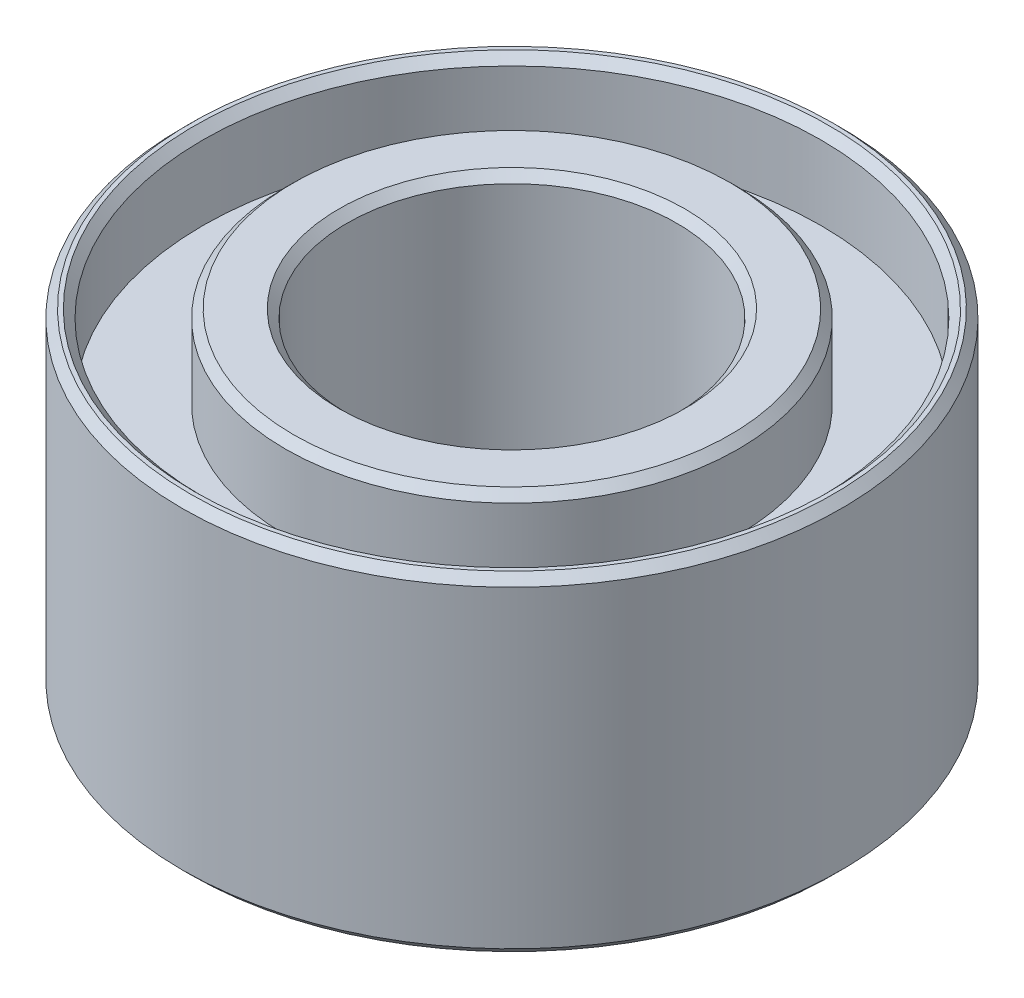
ISO-10303-21;
HEADER;
FILE_DESCRIPTION(('STEP AP214'),'2;1');
FILE_NAME('part.step','',(''),(''),'','','');
FILE_SCHEMA(('AUTOMOTIVE_DESIGN { 1 0 10303 214 1 1 1 1 }'));
ENDSEC;
DATA;
#1=APPLICATION_CONTEXT('core data for automotive mechanical design processes');
#2=APPLICATION_PROTOCOL_DEFINITION('international standard','automotive_design',2000,#1);
#3=PRODUCT_CONTEXT('',#1,'mechanical');
#4=PRODUCT('Part','Part','',(#3));
#5=PRODUCT_RELATED_PRODUCT_CATEGORY('part','',(#4));
#6=PRODUCT_DEFINITION_FORMATION('','',#4);
#7=PRODUCT_DEFINITION_CONTEXT('part definition',#1,'design');
#8=PRODUCT_DEFINITION('design','',#6,#7);
#9=PRODUCT_DEFINITION_SHAPE('','',#8);
#10=(LENGTH_UNIT() NAMED_UNIT(*) SI_UNIT(.MILLI.,.METRE.));
#11=(NAMED_UNIT(*) PLANE_ANGLE_UNIT() SI_UNIT($,.RADIAN.));
#12=(NAMED_UNIT(*) SI_UNIT($,.STERADIAN.) SOLID_ANGLE_UNIT());
#13=UNCERTAINTY_MEASURE_WITH_UNIT(LENGTH_MEASURE(1.E-05),#10,'distance_accuracy_value','');
#14=(GEOMETRIC_REPRESENTATION_CONTEXT(3) GLOBAL_UNCERTAINTY_ASSIGNED_CONTEXT((#13)) GLOBAL_UNIT_ASSIGNED_CONTEXT((#10,
#11,#12)) REPRESENTATION_CONTEXT('',''));
#15=CARTESIAN_POINT('',(0.,0.,0.));
#16=DIRECTION('',(0.,0.,1.));
#17=DIRECTION('',(1.,0.,0.));
#18=AXIS2_PLACEMENT_3D('',#15,#16,#17);
#19=CARTESIAN_POINT('',(0.,0.,0.));
#20=DIRECTION('',(0.,1.,0.));
#21=DIRECTION('',(0.,0.,1.));
#22=AXIS2_PLACEMENT_3D('',#19,#20,#21);
#23=PLANE('',#22);
#24=CARTESIAN_POINT('',(0.,0.,0.));
#25=DIRECTION('',(0.,1.,0.));
#26=DIRECTION('',(0.,0.,1.));
#27=AXIS2_PLACEMENT_3D('',#24,#25,#26);
#28=CIRCLE('',#27,2.65);
#29=CARTESIAN_POINT('',(0.,0.,2.65));
#30=VERTEX_POINT('',#29);
#31=EDGE_CURVE('E74',#30,#30,#28,.F.);
#32=ORIENTED_EDGE('',*,*,#31,.T.);
#33=EDGE_LOOP('',(#32));
#34=FACE_BOUND('',#33,.T.);
#35=CARTESIAN_POINT('',(0.,0.,0.));
#36=DIRECTION('',(0.,1.,0.));
#37=DIRECTION('',(0.,0.,1.));
#38=AXIS2_PLACEMENT_3D('',#35,#36,#37);
#39=CIRCLE('',#38,2.1);
#40=CARTESIAN_POINT('',(0.,0.,2.1));
#41=VERTEX_POINT('',#40);
#42=EDGE_CURVE('E77',#41,#41,#39,.T.);
#43=ORIENTED_EDGE('',*,*,#42,.T.);
#44=EDGE_LOOP('',(#43));
#45=FACE_BOUND('',#44,.T.);
#46=ADVANCED_FACE('F38',(#34,#45),#23,.F.);
#47=CARTESIAN_POINT('',(0.,4.,0.));
#48=DIRECTION('',(0.,1.,0.));
#49=DIRECTION('',(0.,0.,1.));
#50=AXIS2_PLACEMENT_3D('',#47,#48,#49);
#51=PLANE('',#50);
#52=CARTESIAN_POINT('',(0.,4.,0.));
#53=DIRECTION('',(0.,1.,0.));
#54=DIRECTION('',(0.,0.,1.));
#55=AXIS2_PLACEMENT_3D('',#52,#53,#54);
#56=CIRCLE('',#55,2.65);
#57=CARTESIAN_POINT('',(0.,4.,2.65));
#58=VERTEX_POINT('',#57);
#59=EDGE_CURVE('E59',#58,#58,#56,.T.);
#60=ORIENTED_EDGE('',*,*,#59,.T.);
#61=EDGE_LOOP('',(#60));
#62=FACE_BOUND('',#61,.T.);
#63=CARTESIAN_POINT('',(0.,4.,0.));
#64=DIRECTION('',(0.,1.,0.));
#65=DIRECTION('',(0.,0.,1.));
#66=AXIS2_PLACEMENT_3D('',#63,#64,#65);
#67=CIRCLE('',#66,2.1);
#68=CARTESIAN_POINT('',(0.,4.,2.1));
#69=VERTEX_POINT('',#68);
#70=EDGE_CURVE('E62',#69,#69,#67,.F.);
#71=ORIENTED_EDGE('',*,*,#70,.T.);
#72=EDGE_LOOP('',(#71));
#73=FACE_BOUND('',#72,.T.);
#74=ADVANCED_FACE('F129',(#62,#73),#51,.T.);
#75=CARTESIAN_POINT('',(0.,4.,0.));
#76=DIRECTION('',(0.,1.,0.));
#77=DIRECTION('',(0.,0.,1.));
#78=AXIS2_PLACEMENT_3D('',#75,#76,#77);
#79=CIRCLE('',#78,3.9);
#80=CARTESIAN_POINT('',(0.,4.,3.9));
#81=VERTEX_POINT('',#80);
#82=EDGE_CURVE('E46',#81,#81,#79,.T.);
#83=ORIENTED_EDGE('',*,*,#82,.T.);
#84=EDGE_LOOP('',(#83));
#85=FACE_BOUND('',#84,.T.);
#86=CARTESIAN_POINT('',(0.,4.,0.));
#87=DIRECTION('',(0.,1.,0.));
#88=DIRECTION('',(0.,0.,1.));
#89=AXIS2_PLACEMENT_3D('',#86,#87,#88);
#90=CIRCLE('',#89,3.85);
#91=CARTESIAN_POINT('',(0.,4.,3.85));
#92=VERTEX_POINT('',#91);
#93=EDGE_CURVE('E50',#92,#92,#90,.F.);
#94=ORIENTED_EDGE('',*,*,#93,.T.);
#95=EDGE_LOOP('',(#94));
#96=FACE_BOUND('',#95,.T.);
#97=ADVANCED_FACE('F136',(#85,#96),#51,.T.);
#98=CARTESIAN_POINT('',(0.,0.,0.));
#99=DIRECTION('',(0.,1.,0.));
#100=DIRECTION('',(0.,0.,1.));
#101=AXIS2_PLACEMENT_3D('',#98,#99,#100);
#102=CIRCLE('',#101,3.9);
#103=CARTESIAN_POINT('',(0.,0.,3.9));
#104=VERTEX_POINT('',#103);
#105=EDGE_CURVE('E83',#104,#104,#102,.F.);
#106=ORIENTED_EDGE('',*,*,#105,.T.);
#107=EDGE_LOOP('',(#106));
#108=FACE_BOUND('',#107,.T.);
#109=CARTESIAN_POINT('',(0.,0.,0.));
#110=DIRECTION('',(0.,1.,0.));
#111=DIRECTION('',(0.,0.,1.));
#112=AXIS2_PLACEMENT_3D('',#109,#110,#111);
#113=CIRCLE('',#112,3.85);
#114=CARTESIAN_POINT('',(0.,0.,3.85));
#115=VERTEX_POINT('',#114);
#116=EDGE_CURVE('E86',#115,#115,#113,.T.);
#117=ORIENTED_EDGE('',*,*,#116,.T.);
#118=EDGE_LOOP('',(#117));
#119=FACE_BOUND('',#118,.T.);
#120=ADVANCED_FACE('F132',(#108,#119),#23,.F.);
#121=CARTESIAN_POINT('',(0.,4.,0.));
#122=DIRECTION('',(0.,-1.,0.));
#123=DIRECTION('',(0.,0.,-1.));
#124=AXIS2_PLACEMENT_3D('',#121,#122,#123);
#125=CYLINDRICAL_SURFACE('',#124,4.);
#126=CARTESIAN_POINT('',(0.,0.0999999999999985,0.));
#127=DIRECTION('',(0.,1.,0.));
#128=DIRECTION('',(0.,0.,1.));
#129=AXIS2_PLACEMENT_3D('',#126,#127,#128);
#130=CIRCLE('',#129,4.);
#131=CARTESIAN_POINT('',(0.,0.0999999999999985,4.));
#132=VERTEX_POINT('',#131);
#133=EDGE_CURVE('E89',#132,#132,#130,.T.);
#134=ORIENTED_EDGE('',*,*,#133,.T.);
#135=EDGE_LOOP('',(#134));
#136=FACE_BOUND('',#135,.T.);
#137=CARTESIAN_POINT('',(0.,3.9,0.));
#138=DIRECTION('',(0.,1.,0.));
#139=DIRECTION('',(0.,0.,1.));
#140=AXIS2_PLACEMENT_3D('',#137,#138,#139);
#141=CIRCLE('',#140,4.);
#142=CARTESIAN_POINT('',(0.,3.9,4.));
#143=VERTEX_POINT('',#142);
#144=EDGE_CURVE('E92',#143,#143,#141,.F.);
#145=ORIENTED_EDGE('',*,*,#144,.T.);
#146=EDGE_LOOP('',(#145));
#147=FACE_BOUND('',#146,.T.);
#148=ADVANCED_FACE('F142',(#136,#147),#125,.T.);
#149=CARTESIAN_POINT('',(0.,4.,0.));
#150=DIRECTION('',(0.,-1.,0.));
#151=DIRECTION('',(0.,0.,-1.));
#152=AXIS2_PLACEMENT_3D('',#149,#150,#151);
#153=CYLINDRICAL_SURFACE('',#152,2.);
#154=CARTESIAN_POINT('',(0.,0.0999999999999985,0.));
#155=DIRECTION('',(0.,1.,0.));
#156=DIRECTION('',(0.,0.,1.));
#157=AXIS2_PLACEMENT_3D('',#154,#155,#156);
#158=CIRCLE('',#157,2.);
#159=CARTESIAN_POINT('',(0.,0.0999999999999985,2.));
#160=VERTEX_POINT('',#159);
#161=EDGE_CURVE('E65',#160,#160,#158,.F.);
#162=ORIENTED_EDGE('',*,*,#161,.T.);
#163=EDGE_LOOP('',(#162));
#164=FACE_BOUND('',#163,.T.);
#165=CARTESIAN_POINT('',(0.,3.9,0.));
#166=DIRECTION('',(0.,1.,0.));
#167=DIRECTION('',(0.,0.,1.));
#168=AXIS2_PLACEMENT_3D('',#165,#166,#167);
#169=CIRCLE('',#168,2.);
#170=CARTESIAN_POINT('',(0.,3.9,2.));
#171=VERTEX_POINT('',#170);
#172=EDGE_CURVE('E68',#171,#171,#169,.T.);
#173=ORIENTED_EDGE('',*,*,#172,.T.);
#174=EDGE_LOOP('',(#173));
#175=FACE_BOUND('',#174,.T.);
#176=ADVANCED_FACE('F148',(#164,#175),#153,.F.);
#177=CARTESIAN_POINT('',(0.,3.,0.));
#178=DIRECTION('',(0.,1.,0.));
#179=DIRECTION('',(0.,0.,1.));
#180=AXIS2_PLACEMENT_3D('',#177,#178,#179);
#181=CYLINDRICAL_SURFACE('',#180,3.75);
#182=CARTESIAN_POINT('',(0.,3.9,0.));
#183=DIRECTION('',(0.,1.,0.));
#184=DIRECTION('',(0.,0.,1.));
#185=AXIS2_PLACEMENT_3D('',#182,#183,#184);
#186=CIRCLE('',#185,3.75);
#187=CARTESIAN_POINT('',(0.,3.9,3.75));
#188=VERTEX_POINT('',#187);
#189=EDGE_CURVE('E10',#188,#188,#186,.T.);
#190=ORIENTED_EDGE('',*,*,#189,.T.);
#191=EDGE_LOOP('',(#190));
#192=FACE_BOUND('',#191,.T.);
#193=CARTESIAN_POINT('',(0.,3.,0.));
#194=DIRECTION('',(0.,1.,0.));
#195=DIRECTION('',(0.,0.,1.));
#196=AXIS2_PLACEMENT_3D('',#193,#194,#195);
#197=CIRCLE('',#196,3.75);
#198=CARTESIAN_POINT('',(0.,3.,3.75));
#199=VERTEX_POINT('',#198);
#200=EDGE_CURVE('E95',#199,#199,#197,.T.);
#201=ORIENTED_EDGE('',*,*,#200,.F.);
#202=EDGE_LOOP('',(#201));
#203=FACE_BOUND('',#202,.T.);
#204=ADVANCED_FACE('F292',(#192,#203),#181,.F.);
#205=CARTESIAN_POINT('',(0.,3.,0.));
#206=DIRECTION('',(0.,1.,0.));
#207=DIRECTION('',(0.,0.,1.));
#208=AXIS2_PLACEMENT_3D('',#205,#206,#207);
#209=PLANE('',#208);
#210=CARTESIAN_POINT('',(0.,3.,0.));
#211=DIRECTION('',(0.,1.,0.));
#212=DIRECTION('',(0.,0.,1.));
#213=AXIS2_PLACEMENT_3D('',#210,#211,#212);
#214=CIRCLE('',#213,2.75);
#215=CARTESIAN_POINT('',(0.,3.,2.75));
#216=VERTEX_POINT('',#215);
#217=EDGE_CURVE('E98',#216,#216,#214,.T.);
#218=ORIENTED_EDGE('',*,*,#217,.F.);
#219=EDGE_LOOP('',(#218));
#220=FACE_BOUND('',#219,.T.);
#221=ORIENTED_EDGE('',*,*,#200,.T.);
#222=EDGE_LOOP('',(#221));
#223=FACE_BOUND('',#222,.T.);
#224=ADVANCED_FACE('F125',(#220,#223),#209,.T.);
#225=CARTESIAN_POINT('',(0.,3.,0.));
#226=DIRECTION('',(0.,1.,0.));
#227=DIRECTION('',(0.,0.,1.));
#228=AXIS2_PLACEMENT_3D('',#225,#226,#227);
#229=CYLINDRICAL_SURFACE('',#228,2.75);
#230=CARTESIAN_POINT('',(0.,3.9,0.));
#231=DIRECTION('',(0.,1.,0.));
#232=DIRECTION('',(0.,0.,1.));
#233=AXIS2_PLACEMENT_3D('',#230,#231,#232);
#234=CIRCLE('',#233,2.75);
#235=CARTESIAN_POINT('',(0.,3.9,2.75));
#236=VERTEX_POINT('',#235);
#237=EDGE_CURVE('E54',#236,#236,#234,.F.);
#238=ORIENTED_EDGE('',*,*,#237,.T.);
#239=EDGE_LOOP('',(#238));
#240=FACE_BOUND('',#239,.T.);
#241=ORIENTED_EDGE('',*,*,#217,.T.);
#242=EDGE_LOOP('',(#241));
#243=FACE_BOUND('',#242,.T.);
#244=ADVANCED_FACE('F118',(#240,#243),#229,.T.);
#245=CARTESIAN_POINT('',(0.,1.,0.));
#246=DIRECTION('',(0.,-1.,0.));
#247=DIRECTION('',(0.,0.,-1.));
#248=AXIS2_PLACEMENT_3D('',#245,#246,#247);
#249=CYLINDRICAL_SURFACE('',#248,3.75);
#250=CARTESIAN_POINT('',(0.,0.099999999999999,0.));
#251=DIRECTION('',(0.,1.,0.));
#252=DIRECTION('',(0.,0.,1.));
#253=AXIS2_PLACEMENT_3D('',#250,#251,#252);
#254=CIRCLE('',#253,3.75);
#255=CARTESIAN_POINT('',(0.,0.099999999999999,3.75));
#256=VERTEX_POINT('',#255);
#257=EDGE_CURVE('E80',#256,#256,#254,.F.);
#258=ORIENTED_EDGE('',*,*,#257,.T.);
#259=EDGE_LOOP('',(#258));
#260=FACE_BOUND('',#259,.T.);
#261=CARTESIAN_POINT('',(0.,1.,0.));
#262=DIRECTION('',(0.,-1.,0.));
#263=DIRECTION('',(0.,0.,-1.));
#264=AXIS2_PLACEMENT_3D('',#261,#262,#263);
#265=CIRCLE('',#264,3.75);
#266=CARTESIAN_POINT('',(0.,1.,-3.75));
#267=VERTEX_POINT('',#266);
#268=EDGE_CURVE('E101',#267,#267,#265,.T.);
#269=ORIENTED_EDGE('',*,*,#268,.F.);
#270=EDGE_LOOP('',(#269));
#271=FACE_BOUND('',#270,.T.);
#272=ADVANCED_FACE('F113',(#260,#271),#249,.F.);
#273=CARTESIAN_POINT('',(0.,1.,0.));
#274=DIRECTION('',(0.,-1.,0.));
#275=DIRECTION('',(0.,0.,-1.));
#276=AXIS2_PLACEMENT_3D('',#273,#274,#275);
#277=PLANE('',#276);
#278=CARTESIAN_POINT('',(0.,1.,0.));
#279=DIRECTION('',(0.,-1.,0.));
#280=DIRECTION('',(0.,0.,-1.));
#281=AXIS2_PLACEMENT_3D('',#278,#279,#280);
#282=CIRCLE('',#281,2.75);
#283=CARTESIAN_POINT('',(0.,1.,-2.75));
#284=VERTEX_POINT('',#283);
#285=EDGE_CURVE('E104',#284,#284,#282,.T.);
#286=ORIENTED_EDGE('',*,*,#285,.F.);
#287=EDGE_LOOP('',(#286));
#288=FACE_BOUND('',#287,.T.);
#289=ORIENTED_EDGE('',*,*,#268,.T.);
#290=EDGE_LOOP('',(#289));
#291=FACE_BOUND('',#290,.T.);
#292=ADVANCED_FACE('F110',(#288,#291),#277,.T.);
#293=CARTESIAN_POINT('',(0.,1.,0.));
#294=DIRECTION('',(0.,-1.,0.));
#295=DIRECTION('',(0.,0.,-1.));
#296=AXIS2_PLACEMENT_3D('',#293,#294,#295);
#297=CYLINDRICAL_SURFACE('',#296,2.75);
#298=CARTESIAN_POINT('',(0.,0.100000000000003,0.));
#299=DIRECTION('',(0.,1.,0.));
#300=DIRECTION('',(0.,0.,1.));
#301=AXIS2_PLACEMENT_3D('',#298,#299,#300);
#302=CIRCLE('',#301,2.75);
#303=CARTESIAN_POINT('',(0.,0.100000000000003,2.75));
#304=VERTEX_POINT('',#303);
#305=EDGE_CURVE('E71',#304,#304,#302,.T.);
#306=ORIENTED_EDGE('',*,*,#305,.T.);
#307=EDGE_LOOP('',(#306));
#308=FACE_BOUND('',#307,.T.);
#309=ORIENTED_EDGE('',*,*,#285,.T.);
#310=EDGE_LOOP('',(#309));
#311=FACE_BOUND('',#310,.T.);
#312=ADVANCED_FACE('F108',(#308,#311),#297,.T.);
#313=CARTESIAN_POINT('',(0.,0.0999999999999985,0.));
#314=DIRECTION('',(0.,1.,0.));
#315=DIRECTION('',(0.,0.,1.));
#316=AXIS2_PLACEMENT_3D('',#313,#314,#315);
#317=CONICAL_SURFACE('',#316,4.,0.785398163397448);
#318=ORIENTED_EDGE('',*,*,#105,.F.);
#319=EDGE_LOOP('',(#318));
#320=FACE_BOUND('',#319,.T.);
#321=ORIENTED_EDGE('',*,*,#133,.F.);
#322=EDGE_LOOP('',(#321));
#323=FACE_BOUND('',#322,.T.);
#324=ADVANCED_FACE('F158',(#320,#323),#317,.T.);
#325=CARTESIAN_POINT('',(0.,0.099999999999999,0.));
#326=DIRECTION('',(0.,-1.,0.));
#327=DIRECTION('',(0.,0.,-1.));
#328=AXIS2_PLACEMENT_3D('',#325,#326,#327);
#329=CONICAL_SURFACE('',#328,3.75,0.785398163397453);
#330=ORIENTED_EDGE('',*,*,#116,.F.);
#331=EDGE_LOOP('',(#330));
#332=FACE_BOUND('',#331,.T.);
#333=ORIENTED_EDGE('',*,*,#257,.F.);
#334=EDGE_LOOP('',(#333));
#335=FACE_BOUND('',#334,.T.);
#336=ADVANCED_FACE('F154',(#332,#335),#329,.F.);
#337=CARTESIAN_POINT('',(0.,0.,0.));
#338=DIRECTION('',(0.,1.,0.));
#339=DIRECTION('',(0.,0.,1.));
#340=AXIS2_PLACEMENT_3D('',#337,#338,#339);
#341=CONICAL_SURFACE('',#340,2.65,0.785398163397444);
#342=ORIENTED_EDGE('',*,*,#305,.F.);
#343=EDGE_LOOP('',(#342));
#344=FACE_BOUND('',#343,.T.);
#345=ORIENTED_EDGE('',*,*,#31,.F.);
#346=EDGE_LOOP('',(#345));
#347=FACE_BOUND('',#346,.T.);
#348=ADVANCED_FACE('F157',(#344,#347),#341,.T.);
#349=CARTESIAN_POINT('',(0.,0.,0.));
#350=DIRECTION('',(0.,-1.,0.));
#351=DIRECTION('',(0.,0.,-1.));
#352=AXIS2_PLACEMENT_3D('',#349,#350,#351);
#353=CONICAL_SURFACE('',#352,2.1,0.785398163397448);
#354=ORIENTED_EDGE('',*,*,#161,.F.);
#355=EDGE_LOOP('',(#354));
#356=FACE_BOUND('',#355,.T.);
#357=ORIENTED_EDGE('',*,*,#42,.F.);
#358=EDGE_LOOP('',(#357));
#359=FACE_BOUND('',#358,.T.);
#360=ADVANCED_FACE('F165',(#356,#359),#353,.F.);
#361=CARTESIAN_POINT('',(0.,4.,0.));
#362=DIRECTION('',(0.,-1.,0.));
#363=DIRECTION('',(0.,0.,-1.));
#364=AXIS2_PLACEMENT_3D('',#361,#362,#363);
#365=CONICAL_SURFACE('',#364,2.65,0.785398163397444);
#366=ORIENTED_EDGE('',*,*,#237,.F.);
#367=EDGE_LOOP('',(#366));
#368=FACE_BOUND('',#367,.T.);
#369=ORIENTED_EDGE('',*,*,#59,.F.);
#370=EDGE_LOOP('',(#369));
#371=FACE_BOUND('',#370,.T.);
#372=ADVANCED_FACE('F184',(#368,#371),#365,.T.);
#373=CARTESIAN_POINT('',(0.,3.9,0.));
#374=DIRECTION('',(0.,1.,0.));
#375=DIRECTION('',(0.,0.,1.));
#376=AXIS2_PLACEMENT_3D('',#373,#374,#375);
#377=CONICAL_SURFACE('',#376,2.,0.785398163397448);
#378=ORIENTED_EDGE('',*,*,#70,.F.);
#379=EDGE_LOOP('',(#378));
#380=FACE_BOUND('',#379,.T.);
#381=ORIENTED_EDGE('',*,*,#172,.F.);
#382=EDGE_LOOP('',(#381));
#383=FACE_BOUND('',#382,.T.);
#384=ADVANCED_FACE('F191',(#380,#383),#377,.F.);
#385=CARTESIAN_POINT('',(0.,4.,0.));
#386=DIRECTION('',(0.,-1.,0.));
#387=DIRECTION('',(0.,0.,-1.));
#388=AXIS2_PLACEMENT_3D('',#385,#386,#387);
#389=CONICAL_SURFACE('',#388,3.9,0.785398163397457);
#390=ORIENTED_EDGE('',*,*,#144,.F.);
#391=EDGE_LOOP('',(#390));
#392=FACE_BOUND('',#391,.T.);
#393=ORIENTED_EDGE('',*,*,#82,.F.);
#394=EDGE_LOOP('',(#393));
#395=FACE_BOUND('',#394,.T.);
#396=ADVANCED_FACE('F197',(#392,#395),#389,.T.);
#397=CARTESIAN_POINT('',(0.,3.9,0.));
#398=DIRECTION('',(0.,1.,0.));
#399=DIRECTION('',(0.,0.,1.));
#400=AXIS2_PLACEMENT_3D('',#397,#398,#399);
#401=CONICAL_SURFACE('',#400,3.75,0.78539816339745);
#402=ORIENTED_EDGE('',*,*,#93,.F.);
#403=EDGE_LOOP('',(#402));
#404=FACE_BOUND('',#403,.T.);
#405=ORIENTED_EDGE('',*,*,#189,.F.);
#406=EDGE_LOOP('',(#405));
#407=FACE_BOUND('',#406,.T.);
#408=ADVANCED_FACE('F41',(#404,#407),#401,.F.);
#409=CLOSED_SHELL('',(#46,#74,#97,#120,#148,#176,#204,#224,#244,#272,#292,#312,#324,#336,#348,
#360,#372,#384,#396,#408));
#410=MANIFOLD_SOLID_BREP('B2',#409);
#411=ADVANCED_BREP_SHAPE_REPRESENTATION('',(#18,#410),#14);
#412=SHAPE_DEFINITION_REPRESENTATION(#9,#411);
ENDSEC;
END-ISO-10303-21;
